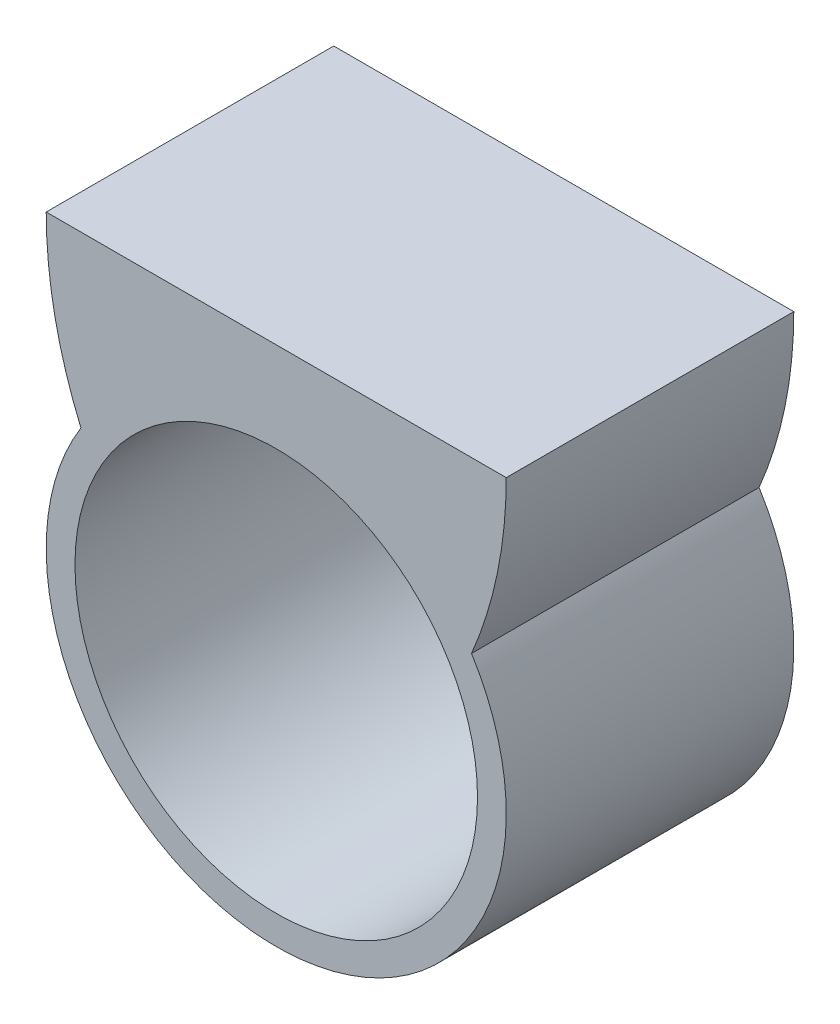
ISO-10303-21;
HEADER;
FILE_DESCRIPTION(('STEP AP214'),'2;1');
FILE_NAME('part.step','',(''),(''),'','','');
FILE_SCHEMA(('AUTOMOTIVE_DESIGN { 1 0 10303 214 1 1 1 1 }'));
ENDSEC;
DATA;
#1=APPLICATION_CONTEXT('core data for automotive mechanical design processes');
#2=APPLICATION_PROTOCOL_DEFINITION('international standard','automotive_design',2000,#1);
#3=PRODUCT_CONTEXT('',#1,'mechanical');
#4=PRODUCT('Part','Part','',(#3));
#5=PRODUCT_RELATED_PRODUCT_CATEGORY('part','',(#4));
#6=PRODUCT_DEFINITION_FORMATION('','',#4);
#7=PRODUCT_DEFINITION_CONTEXT('part definition',#1,'design');
#8=PRODUCT_DEFINITION('design','',#6,#7);
#9=PRODUCT_DEFINITION_SHAPE('','',#8);
#10=(LENGTH_UNIT() NAMED_UNIT(*) SI_UNIT(.MILLI.,.METRE.));
#11=(NAMED_UNIT(*) PLANE_ANGLE_UNIT() SI_UNIT($,.RADIAN.));
#12=(NAMED_UNIT(*) SI_UNIT($,.STERADIAN.) SOLID_ANGLE_UNIT());
#13=UNCERTAINTY_MEASURE_WITH_UNIT(LENGTH_MEASURE(1.E-05),#10,'distance_accuracy_value','');
#14=(GEOMETRIC_REPRESENTATION_CONTEXT(3) GLOBAL_UNCERTAINTY_ASSIGNED_CONTEXT((#13)) GLOBAL_UNIT_ASSIGNED_CONTEXT((#10,
#11,#12)) REPRESENTATION_CONTEXT('',''));
#15=CARTESIAN_POINT('',(0.,0.,0.));
#16=DIRECTION('',(0.,0.,1.));
#17=DIRECTION('',(1.,0.,0.));
#18=AXIS2_PLACEMENT_3D('',#15,#16,#17);
#19=CARTESIAN_POINT('',(0.,-10.9788535328673,62.5));
#20=DIRECTION('',(0.,0.,-1.));
#21=DIRECTION('',(-1.,0.,0.));
#22=AXIS2_PLACEMENT_3D('',#19,#20,#21);
#23=CYLINDRICAL_SURFACE('',#22,60.);
#24=DIRECTION('',(0.,0.,1.));
#25=VECTOR('',#24,1.);
#26=CARTESIAN_POINT('',(50.9379024436842,20.7280872630801,-12.5));
#27=LINE('',#26,#25);
#28=CARTESIAN_POINT('',(50.9379024436842,20.7280872630801,-12.5));
#29=VERTEX_POINT('',#28);
#30=CARTESIAN_POINT('',(50.9379024436842,20.7280872630801,62.5));
#31=VERTEX_POINT('',#30);
#32=EDGE_CURVE('E103',#29,#31,#27,.T.);
#33=ORIENTED_EDGE('',*,*,#32,.T.);
#34=CARTESIAN_POINT('',(0.,-10.9788535328673,62.5));
#35=DIRECTION('',(0.,0.,1.));
#36=DIRECTION('',(1.,0.,0.));
#37=AXIS2_PLACEMENT_3D('',#34,#35,#36);
#38=CIRCLE('',#37,60.);
#39=CARTESIAN_POINT('',(-50.9379024436842,20.7280872630801,62.5));
#40=VERTEX_POINT('',#39);
#41=EDGE_CURVE('E11',#40,#31,#38,.T.);
#42=ORIENTED_EDGE('',*,*,#41,.F.);
#43=DIRECTION('',(0.,0.,1.));
#44=VECTOR('',#43,1.);
#45=CARTESIAN_POINT('',(-50.9379024436842,20.7280872630801,-12.5));
#46=LINE('',#45,#44);
#47=CARTESIAN_POINT('',(-50.9379024436842,20.7280872630801,-12.5));
#48=VERTEX_POINT('',#47);
#49=EDGE_CURVE('E90',#48,#40,#46,.T.);
#50=ORIENTED_EDGE('',*,*,#49,.F.);
#51=CARTESIAN_POINT('',(0.,-10.9788535328673,-12.5));
#52=DIRECTION('',(0.,0.,1.));
#53=DIRECTION('',(1.,0.,0.));
#54=AXIS2_PLACEMENT_3D('',#51,#52,#53);
#55=CIRCLE('',#54,60.);
#56=EDGE_CURVE('E45',#48,#29,#55,.T.);
#57=ORIENTED_EDGE('',*,*,#56,.T.);
#58=EDGE_LOOP('',(#33,#42,#50,#57));
#59=FACE_BOUND('',#58,.T.);
#60=ADVANCED_FACE('F42',(#59),#23,.T.);
#61=CARTESIAN_POINT('',(0.,-10.9788535328673,62.5));
#62=DIRECTION('',(0.,0.,1.));
#63=DIRECTION('',(1.,0.,0.));
#64=AXIS2_PLACEMENT_3D('',#61,#62,#63);
#65=PLANE('',#64);
#66=ORIENTED_EDGE('',*,*,#41,.T.);
#67=CARTESIAN_POINT('',(-52.5516055035965,64.9749588617246,62.5));
#68=DIRECTION('',(0.,0.,1.));
#69=DIRECTION('',(1.,0.,0.));
#70=AXIS2_PLACEMENT_3D('',#67,#68,#69);
#71=CIRCLE('',#70,112.551605503596);
#72=CARTESIAN_POINT('',(60.,64.9749588617246,62.5));
#73=VERTEX_POINT('',#72);
#74=EDGE_CURVE('E128',#73,#31,#71,.F.);
#75=ORIENTED_EDGE('',*,*,#74,.F.);
#76=DIRECTION('',(-1.,0.,0.));
#77=VECTOR('',#76,1.);
#78=CARTESIAN_POINT('',(0.,64.9749588617246,62.5));
#79=LINE('',#78,#77);
#80=CARTESIAN_POINT('',(-60.,64.9749588617246,62.5));
#81=VERTEX_POINT('',#80);
#82=EDGE_CURVE('E132',#73,#81,#79,.T.);
#83=ORIENTED_EDGE('',*,*,#82,.T.);
#84=CARTESIAN_POINT('',(52.5516055035965,64.9749588617246,62.5));
#85=DIRECTION('',(0.,0.,1.));
#86=DIRECTION('',(1.,0.,0.));
#87=AXIS2_PLACEMENT_3D('',#84,#85,#86);
#88=CIRCLE('',#87,112.551605503596);
#89=EDGE_CURVE('E56',#81,#40,#88,.T.);
#90=ORIENTED_EDGE('',*,*,#89,.T.);
#91=EDGE_LOOP('',(#66,#75,#83,#90));
#92=FACE_BOUND('',#91,.T.);
#93=CARTESIAN_POINT('',(0.,-10.9788535328673,62.5));
#94=DIRECTION('',(0.,0.,1.));
#95=DIRECTION('',(1.,0.,0.));
#96=AXIS2_PLACEMENT_3D('',#93,#94,#95);
#97=CIRCLE('',#96,52.5);
#98=CARTESIAN_POINT('',(52.5,-10.9788535328673,62.5));
#99=VERTEX_POINT('',#98);
#100=EDGE_CURVE('E109',#99,#99,#97,.T.);
#101=ORIENTED_EDGE('',*,*,#100,.F.);
#102=EDGE_LOOP('',(#101));
#103=FACE_BOUND('',#102,.T.);
#104=ADVANCED_FACE('F138',(#92,#103),#65,.T.);
#105=CARTESIAN_POINT('',(0.,-10.9788535328673,-12.5));
#106=DIRECTION('',(0.,0.,1.));
#107=DIRECTION('',(1.,0.,0.));
#108=AXIS2_PLACEMENT_3D('',#105,#106,#107);
#109=PLANE('',#108);
#110=ORIENTED_EDGE('',*,*,#56,.F.);
#111=CARTESIAN_POINT('',(52.5516055035965,64.9749588617246,-12.5));
#112=DIRECTION('',(0.,0.,1.));
#113=DIRECTION('',(1.,0.,0.));
#114=AXIS2_PLACEMENT_3D('',#111,#112,#113);
#115=CIRCLE('',#114,112.551605503596);
#116=CARTESIAN_POINT('',(-60.,64.9749588617246,-12.5));
#117=VERTEX_POINT('',#116);
#118=EDGE_CURVE('E87',#117,#48,#115,.T.);
#119=ORIENTED_EDGE('',*,*,#118,.F.);
#120=DIRECTION('',(-1.,0.,0.));
#121=VECTOR('',#120,1.);
#122=CARTESIAN_POINT('',(0.,64.9749588617246,-12.5));
#123=LINE('',#122,#121);
#124=CARTESIAN_POINT('',(60.,64.9749588617246,-12.5));
#125=VERTEX_POINT('',#124);
#126=EDGE_CURVE('E97',#125,#117,#123,.T.);
#127=ORIENTED_EDGE('',*,*,#126,.F.);
#128=CARTESIAN_POINT('',(-52.5516055035965,64.9749588617246,-12.5));
#129=DIRECTION('',(0.,0.,1.));
#130=DIRECTION('',(1.,0.,0.));
#131=AXIS2_PLACEMENT_3D('',#128,#129,#130);
#132=CIRCLE('',#131,112.551605503596);
#133=EDGE_CURVE('E96',#125,#29,#132,.F.);
#134=ORIENTED_EDGE('',*,*,#133,.T.);
#135=EDGE_LOOP('',(#110,#119,#127,#134));
#136=FACE_BOUND('',#135,.T.);
#137=CARTESIAN_POINT('',(0.,-10.9788535328673,-12.5));
#138=DIRECTION('',(0.,0.,1.));
#139=DIRECTION('',(1.,0.,0.));
#140=AXIS2_PLACEMENT_3D('',#137,#138,#139);
#141=CIRCLE('',#140,52.5);
#142=CARTESIAN_POINT('',(52.5,-10.9788535328673,-12.5));
#143=VERTEX_POINT('',#142);
#144=EDGE_CURVE('E113',#143,#143,#141,.T.);
#145=ORIENTED_EDGE('',*,*,#144,.T.);
#146=EDGE_LOOP('',(#145));
#147=FACE_BOUND('',#146,.T.);
#148=ADVANCED_FACE('F105',(#136,#147),#109,.F.);
#149=CARTESIAN_POINT('',(0.,-10.9788535328673,62.5));
#150=DIRECTION('',(0.,0.,-1.));
#151=DIRECTION('',(-1.,0.,0.));
#152=AXIS2_PLACEMENT_3D('',#149,#150,#151);
#153=CYLINDRICAL_SURFACE('',#152,52.5);
#154=ORIENTED_EDGE('',*,*,#100,.T.);
#155=EDGE_LOOP('',(#154));
#156=FACE_BOUND('',#155,.T.);
#157=ORIENTED_EDGE('',*,*,#144,.F.);
#158=EDGE_LOOP('',(#157));
#159=FACE_BOUND('',#158,.T.);
#160=ADVANCED_FACE('F148',(#156,#159),#153,.F.);
#161=CARTESIAN_POINT('',(0.,64.9749588617246,-12.5));
#162=DIRECTION('',(0.,1.,0.));
#163=DIRECTION('',(0.,0.,1.));
#164=AXIS2_PLACEMENT_3D('',#161,#162,#163);
#165=PLANE('',#164);
#166=ORIENTED_EDGE('',*,*,#82,.F.);
#167=DIRECTION('',(0.,0.,1.));
#168=VECTOR('',#167,1.);
#169=CARTESIAN_POINT('',(60.,64.9749588617246,-12.5));
#170=LINE('',#169,#168);
#171=EDGE_CURVE('E65',#125,#73,#170,.T.);
#172=ORIENTED_EDGE('',*,*,#171,.F.);
#173=ORIENTED_EDGE('',*,*,#126,.T.);
#174=DIRECTION('',(0.,0.,1.));
#175=VECTOR('',#174,1.);
#176=CARTESIAN_POINT('',(-60.,64.9749588617246,-12.5));
#177=LINE('',#176,#175);
#178=EDGE_CURVE('E85',#117,#81,#177,.T.);
#179=ORIENTED_EDGE('',*,*,#178,.T.);
#180=EDGE_LOOP('',(#166,#172,#173,#179));
#181=FACE_BOUND('',#180,.T.);
#182=ADVANCED_FACE('F137',(#181),#165,.T.);
#183=CARTESIAN_POINT('',(-52.5516055035965,64.9749588617246,-12.5));
#184=DIRECTION('',(0.,0.,1.));
#185=DIRECTION('',(1.,0.,0.));
#186=AXIS2_PLACEMENT_3D('',#183,#184,#185);
#187=CYLINDRICAL_SURFACE('',#186,112.551605503596);
#188=ORIENTED_EDGE('',*,*,#74,.T.);
#189=ORIENTED_EDGE('',*,*,#32,.F.);
#190=ORIENTED_EDGE('',*,*,#133,.F.);
#191=ORIENTED_EDGE('',*,*,#171,.T.);
#192=EDGE_LOOP('',(#188,#189,#190,#191));
#193=FACE_BOUND('',#192,.T.);
#194=ADVANCED_FACE('F140',(#193),#187,.T.);
#195=CARTESIAN_POINT('',(52.5516055035965,64.9749588617246,-12.5));
#196=DIRECTION('',(0.,0.,1.));
#197=DIRECTION('',(1.,0.,0.));
#198=AXIS2_PLACEMENT_3D('',#195,#196,#197);
#199=CYLINDRICAL_SURFACE('',#198,112.551605503596);
#200=ORIENTED_EDGE('',*,*,#89,.F.);
#201=ORIENTED_EDGE('',*,*,#178,.F.);
#202=ORIENTED_EDGE('',*,*,#118,.T.);
#203=ORIENTED_EDGE('',*,*,#49,.T.);
#204=EDGE_LOOP('',(#200,#201,#202,#203));
#205=FACE_BOUND('',#204,.T.);
#206=ADVANCED_FACE('F89',(#205),#199,.T.);
#207=CLOSED_SHELL('',(#60,#104,#148,#160,#182,#194,#206));
#208=MANIFOLD_SOLID_BREP('B2',#207);
#209=ADVANCED_BREP_SHAPE_REPRESENTATION('',(#18,#208),#14);
#210=SHAPE_DEFINITION_REPRESENTATION(#9,#209);
ENDSEC;
END-ISO-10303-21;
